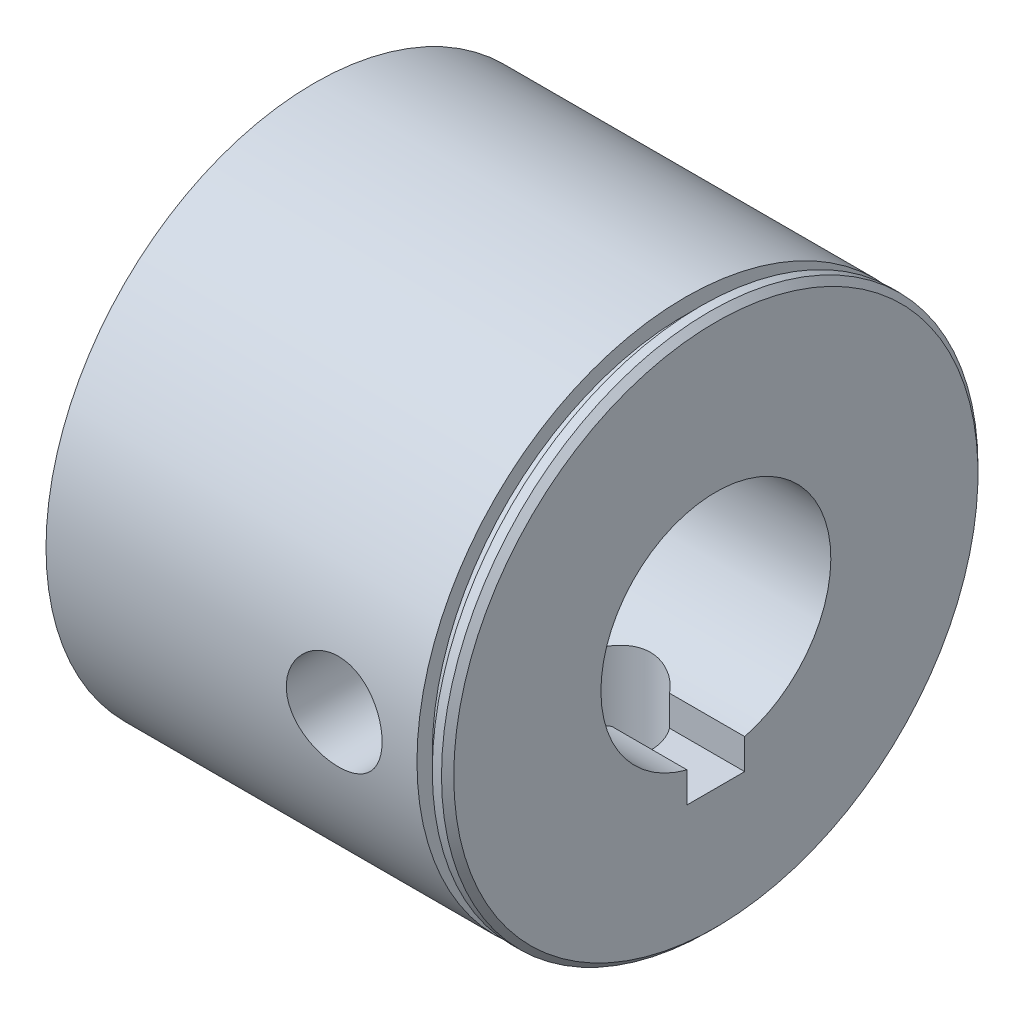
ISO-10303-21;
HEADER;
FILE_DESCRIPTION(('STEP AP214'),'2;1');
FILE_NAME('part.step','',(''),(''),'','','');
FILE_SCHEMA(('AUTOMOTIVE_DESIGN { 1 0 10303 214 1 1 1 1 }'));
ENDSEC;
DATA;
#1=APPLICATION_CONTEXT('core data for automotive mechanical design processes');
#2=APPLICATION_PROTOCOL_DEFINITION('international standard','automotive_design',2000,#1);
#3=PRODUCT_CONTEXT('',#1,'mechanical');
#4=PRODUCT('Part','Part','',(#3));
#5=PRODUCT_RELATED_PRODUCT_CATEGORY('part','',(#4));
#6=PRODUCT_DEFINITION_FORMATION('','',#4);
#7=PRODUCT_DEFINITION_CONTEXT('part definition',#1,'design');
#8=PRODUCT_DEFINITION('design','',#6,#7);
#9=PRODUCT_DEFINITION_SHAPE('','',#8);
#10=(LENGTH_UNIT() NAMED_UNIT(*) SI_UNIT(.MILLI.,.METRE.));
#11=(NAMED_UNIT(*) PLANE_ANGLE_UNIT() SI_UNIT($,.RADIAN.));
#12=(NAMED_UNIT(*) SI_UNIT($,.STERADIAN.) SOLID_ANGLE_UNIT());
#13=UNCERTAINTY_MEASURE_WITH_UNIT(LENGTH_MEASURE(1.E-05),#10,'distance_accuracy_value','');
#14=(GEOMETRIC_REPRESENTATION_CONTEXT(3) GLOBAL_UNCERTAINTY_ASSIGNED_CONTEXT((#13)) GLOBAL_UNIT_ASSIGNED_CONTEXT((#10,
#11,#12)) REPRESENTATION_CONTEXT('',''));
#15=CARTESIAN_POINT('',(0.,0.,0.));
#16=DIRECTION('',(0.,0.,1.));
#17=DIRECTION('',(1.,0.,0.));
#18=AXIS2_PLACEMENT_3D('',#15,#16,#17);
#19=CARTESIAN_POINT('',(29.6418,0.,0.));
#20=DIRECTION('',(-1.,0.,0.));
#21=DIRECTION('',(0.,0.,1.));
#22=AXIS2_PLACEMENT_3D('',#19,#20,#21);
#23=CONICAL_SURFACE('',#22,22.225,0.785398163397455);
#24=CARTESIAN_POINT('',(30.1498,0.,0.));
#25=DIRECTION('',(-1.,0.,0.));
#26=DIRECTION('',(0.,0.,1.));
#27=AXIS2_PLACEMENT_3D('',#24,#25,#26);
#28=CIRCLE('',#27,21.717);
#29=CARTESIAN_POINT('',(30.1498,0.,21.717));
#30=VERTEX_POINT('',#29);
#31=EDGE_CURVE('E20',#30,#30,#28,.F.);
#32=ORIENTED_EDGE('',*,*,#31,.F.);
#33=EDGE_LOOP('',(#32));
#34=FACE_BOUND('',#33,.T.);
#35=CARTESIAN_POINT('',(29.6418,0.,0.));
#36=DIRECTION('',(1.,0.,0.));
#37=DIRECTION('',(0.,1.,0.));
#38=AXIS2_PLACEMENT_3D('',#35,#36,#37);
#39=CIRCLE('',#38,22.225);
#40=CARTESIAN_POINT('',(29.6418,22.225,0.));
#41=VERTEX_POINT('',#40);
#42=EDGE_CURVE('E139',#41,#41,#39,.F.);
#43=ORIENTED_EDGE('',*,*,#42,.F.);
#44=EDGE_LOOP('',(#43));
#45=FACE_BOUND('',#44,.T.);
#46=ADVANCED_FACE('F17',(#34,#45),#23,.T.);
#47=CARTESIAN_POINT('',(30.1498,0.,0.));
#48=DIRECTION('',(1.,0.,0.));
#49=DIRECTION('',(0.,1.,0.));
#50=AXIS2_PLACEMENT_3D('',#47,#48,#49);
#51=CYLINDRICAL_SURFACE('',#50,22.225);
#52=CARTESIAN_POINT('',(28.8798,0.,0.));
#53=DIRECTION('',(1.,0.,0.));
#54=DIRECTION('',(0.,1.,0.));
#55=AXIS2_PLACEMENT_3D('',#52,#53,#54);
#56=CIRCLE('',#55,22.225);
#57=CARTESIAN_POINT('',(28.8798,22.225,0.));
#58=VERTEX_POINT('',#57);
#59=EDGE_CURVE('E95',#58,#58,#56,.F.);
#60=ORIENTED_EDGE('',*,*,#59,.F.);
#61=EDGE_LOOP('',(#60));
#62=FACE_BOUND('',#61,.T.);
#63=ORIENTED_EDGE('',*,*,#42,.T.);
#64=EDGE_LOOP('',(#63));
#65=FACE_BOUND('',#64,.T.);
#66=ADVANCED_FACE('F290',(#62,#65),#51,.T.);
#67=CARTESIAN_POINT('',(30.1498,0.,0.));
#68=DIRECTION('',(1.,0.,0.));
#69=DIRECTION('',(0.,1.,0.));
#70=AXIS2_PLACEMENT_3D('',#67,#68,#69);
#71=PLANE('',#70);
#72=DIRECTION('',(0.,0.,-1.));
#73=VECTOR('',#72,1.);
#74=CARTESIAN_POINT('',(30.1498,-11.7348,2.38759999999982));
#75=LINE('',#74,#73);
#76=CARTESIAN_POINT('',(30.1498,-11.7348,-2.38760000000017));
#77=VERTEX_POINT('',#76);
#78=CARTESIAN_POINT('',(30.1498,-11.7348,2.38759999999982));
#79=VERTEX_POINT('',#78);
#80=EDGE_CURVE('E124',#77,#79,#75,.F.);
#81=ORIENTED_EDGE('',*,*,#80,.T.);
#82=DIRECTION('',(0.,-1.,0.));
#83=VECTOR('',#82,1.);
#84=CARTESIAN_POINT('',(30.1498,0.,2.3876));
#85=LINE('',#84,#83);
#86=CARTESIAN_POINT('',(30.1498,-9.22089969796878,2.38759999999986));
#87=VERTEX_POINT('',#86);
#88=EDGE_CURVE('E80',#79,#87,#85,.F.);
#89=ORIENTED_EDGE('',*,*,#88,.T.);
#90=CARTESIAN_POINT('',(30.1498,0.,0.));
#91=DIRECTION('',(1.,0.,0.));
#92=DIRECTION('',(0.,0.,-1.));
#93=AXIS2_PLACEMENT_3D('',#90,#91,#92);
#94=CIRCLE('',#93,9.525);
#95=CARTESIAN_POINT('',(30.1498,-9.22089969796871,-2.38760000000013));
#96=VERTEX_POINT('',#95);
#97=EDGE_CURVE('E98',#87,#96,#94,.F.);
#98=ORIENTED_EDGE('',*,*,#97,.T.);
#99=DIRECTION('',(0.,1.,0.));
#100=VECTOR('',#99,1.);
#101=CARTESIAN_POINT('',(30.1498,0.,-2.3876));
#102=LINE('',#101,#100);
#103=EDGE_CURVE('E86',#96,#77,#102,.F.);
#104=ORIENTED_EDGE('',*,*,#103,.T.);
#105=EDGE_LOOP('',(#81,#89,#98,#104));
#106=FACE_BOUND('',#105,.T.);
#107=ORIENTED_EDGE('',*,*,#31,.T.);
#108=EDGE_LOOP('',(#107));
#109=FACE_BOUND('',#108,.T.);
#110=ADVANCED_FACE('F99',(#106,#109),#71,.T.);
#111=CARTESIAN_POINT('',(28.8798,22.225,0.));
#112=DIRECTION('',(-1.,0.,0.));
#113=DIRECTION('',(0.,0.,1.));
#114=AXIS2_PLACEMENT_3D('',#111,#112,#113);
#115=PLANE('',#114);
#116=CARTESIAN_POINT('',(28.8798,0.,0.));
#117=DIRECTION('',(-1.,0.,0.));
#118=DIRECTION('',(0.,0.,1.));
#119=AXIS2_PLACEMENT_3D('',#116,#117,#118);
#120=CIRCLE('',#119,20.955);
#121=CARTESIAN_POINT('',(28.8798,0.,20.955));
#122=VERTEX_POINT('',#121);
#123=EDGE_CURVE('E197',#122,#122,#120,.T.);
#124=ORIENTED_EDGE('',*,*,#123,.F.);
#125=EDGE_LOOP('',(#124));
#126=FACE_BOUND('',#125,.T.);
#127=ORIENTED_EDGE('',*,*,#59,.T.);
#128=EDGE_LOOP('',(#127));
#129=FACE_BOUND('',#128,.T.);
#130=ADVANCED_FACE('F288',(#126,#129),#115,.T.);
#131=CARTESIAN_POINT('',(-89.79,0.,-2.3876));
#132=DIRECTION('',(0.,0.,-1.));
#133=DIRECTION('',(0.,1.,0.));
#134=AXIS2_PLACEMENT_3D('',#131,#132,#133);
#135=PLANE('',#134);
#136=DIRECTION('',(1.,0.,0.));
#137=VECTOR('',#136,1.);
#138=CARTESIAN_POINT('',(30.1498,-9.22089969796871,-2.38760000000013));
#139=LINE('',#138,#137);
#140=CARTESIAN_POINT('',(23.9220275632044,-9.22089969796871,-2.3876000000001));
#141=VERTEX_POINT('',#140);
#142=EDGE_CURVE('E89',#96,#141,#139,.F.);
#143=ORIENTED_EDGE('',*,*,#142,.T.);
#144=DIRECTION('',(0.,1.,0.));
#145=VECTOR('',#144,1.);
#146=CARTESIAN_POINT('',(23.9220275632044,0.,-2.38760000000007));
#147=LINE('',#146,#145);
#148=CARTESIAN_POINT('',(23.9220275632044,-11.7348,-2.38760000000012));
#149=VERTEX_POINT('',#148);
#150=EDGE_CURVE('E229',#141,#149,#147,.F.);
#151=ORIENTED_EDGE('',*,*,#150,.T.);
#152=DIRECTION('',(1.,0.,0.));
#153=VECTOR('',#152,1.);
#154=CARTESIAN_POINT('',(-89.79,-11.7347999999999,-2.38760000000017));
#155=LINE('',#154,#153);
#156=EDGE_CURVE('E92',#149,#77,#155,.T.);
#157=ORIENTED_EDGE('',*,*,#156,.T.);
#158=ORIENTED_EDGE('',*,*,#103,.F.);
#159=EDGE_LOOP('',(#143,#151,#157,#158));
#160=FACE_BOUND('',#159,.T.);
#161=ADVANCED_FACE('F87',(#160),#135,.F.);
#162=CARTESIAN_POINT('',(-89.79,-11.7348,2.38759999999982));
#163=DIRECTION('',(0.,-1.,0.));
#164=DIRECTION('',(0.,0.,-1.));
#165=AXIS2_PLACEMENT_3D('',#162,#163,#164);
#166=PLANE('',#165);
#167=DIRECTION('',(1.,0.,0.));
#168=VECTOR('',#167,1.);
#169=CARTESIAN_POINT('',(-89.79,-11.7348,2.38759999999982));
#170=LINE('',#169,#168);
#171=CARTESIAN_POINT('',(23.9220275632046,-11.7348,2.38759999999984));
#172=VERTEX_POINT('',#171);
#173=EDGE_CURVE('E117',#172,#79,#170,.T.);
#174=ORIENTED_EDGE('',*,*,#173,.T.);
#175=ORIENTED_EDGE('',*,*,#80,.F.);
#176=ORIENTED_EDGE('',*,*,#156,.F.);
#177=CARTESIAN_POINT('',(20.7518,-11.7348,0.));
#178=DIRECTION('',(0.,1.,0.));
#179=DIRECTION('',(0.,0.,1.));
#180=AXIS2_PLACEMENT_3D('',#177,#178,#179);
#181=CIRCLE('',#180,3.96875000000016);
#182=EDGE_CURVE('E227',#149,#172,#181,.F.);
#183=ORIENTED_EDGE('',*,*,#182,.T.);
#184=EDGE_LOOP('',(#174,#175,#176,#183));
#185=FACE_BOUND('',#184,.T.);
#186=ADVANCED_FACE('F308',(#185),#166,.F.);
#187=CARTESIAN_POINT('',(-89.79,0.,2.3876));
#188=DIRECTION('',(0.,0.,1.));
#189=DIRECTION('',(0.,-1.,0.));
#190=AXIS2_PLACEMENT_3D('',#187,#188,#189);
#191=PLANE('',#190);
#192=DIRECTION('',(1.,0.,0.));
#193=VECTOR('',#192,1.);
#194=CARTESIAN_POINT('',(30.1498,-9.22089969796878,2.38759999999986));
#195=LINE('',#194,#193);
#196=CARTESIAN_POINT('',(23.9220275632046,-9.22089969796878,2.38759999999986));
#197=VERTEX_POINT('',#196);
#198=EDGE_CURVE('E105',#197,#87,#195,.T.);
#199=ORIENTED_EDGE('',*,*,#198,.T.);
#200=ORIENTED_EDGE('',*,*,#88,.F.);
#201=ORIENTED_EDGE('',*,*,#173,.F.);
#202=DIRECTION('',(0.,1.,0.));
#203=VECTOR('',#202,1.);
#204=CARTESIAN_POINT('',(23.9220275632046,0.,2.38759999999986));
#205=LINE('',#204,#203);
#206=EDGE_CURVE('E226',#172,#197,#205,.T.);
#207=ORIENTED_EDGE('',*,*,#206,.T.);
#208=EDGE_LOOP('',(#199,#200,#201,#207));
#209=FACE_BOUND('',#208,.T.);
#210=ADVANCED_FACE('F205',(#209),#191,.F.);
#211=CARTESIAN_POINT('',(30.1498,0.,0.));
#212=DIRECTION('',(1.,0.,0.));
#213=DIRECTION('',(0.,0.,-1.));
#214=AXIS2_PLACEMENT_3D('',#211,#212,#213);
#215=CYLINDRICAL_SURFACE('',#214,9.525);
#216=CARTESIAN_POINT('',(20.7518,-3.96875000000003,8.65879024099208));
#217=CARTESIAN_POINT('',(20.8578530929872,-3.96875345794214,8.65878657877948));
#218=CARTESIAN_POINT('',(20.9638730324885,-3.96449709079524,8.66074282150398));
#219=CARTESIAN_POINT('',(21.1751248510294,-3.94753019537077,8.66849040530834));
#220=CARTESIAN_POINT('',(21.2803565951006,-3.93481825120507,8.67428238868304));
#221=CARTESIAN_POINT('',(21.4892627782111,-3.90106722515466,8.68951324474217));
#222=CARTESIAN_POINT('',(21.5929363787864,-3.88002381554369,8.69895401270356));
#223=CARTESIAN_POINT('',(21.7979554621619,-3.82984231627085,8.72116264093307));
#224=CARTESIAN_POINT('',(21.899300005952,-3.80070102167462,8.73393181837569));
#225=CARTESIAN_POINT('',(22.1980509739908,-3.70177591753157,8.77654133512902));
#226=CARTESIAN_POINT('',(22.3911136335153,-3.62033653507982,8.81075784381483));
#227=CARTESIAN_POINT('',(22.7607671288055,-3.42905732293149,8.8869410521563));
#228=CARTESIAN_POINT('',(22.9373548256708,-3.31921209617303,8.92890922418128));
#229=CARTESIAN_POINT('',(23.2801166007337,-3.06698058400019,9.01876739103891));
#230=CARTESIAN_POINT('',(23.4451483490789,-2.92311286929135,9.06685761217828));
#231=CARTESIAN_POINT('',(23.74964941965,-2.60989482739701,9.16191979527028));
#232=CARTESIAN_POINT('',(23.8891076701367,-2.44053352057238,9.20889126525164));
#233=CARTESIAN_POINT('',(24.0790685405119,-2.16642299532665,9.27586449527777));
#234=CARTESIAN_POINT('',(24.1402495969044,-2.06943809274469,9.29803429099985));
#235=CARTESIAN_POINT('',(24.2541620047798,-1.87018393644445,9.34014905081815));
#236=CARTESIAN_POINT('',(24.3068967285485,-1.7679168133838,9.36009490187594));
#237=CARTESIAN_POINT('',(24.4034031211505,-1.55885091741736,9.39717346201771));
#238=CARTESIAN_POINT('',(24.4471822503326,-1.4520560066127,9.41430851022969));
#239=CARTESIAN_POINT('',(24.5253806796708,-1.23467043981326,9.44527793798247));
#240=CARTESIAN_POINT('',(24.5598023877699,-1.12408076858852,9.45911316655249));
#241=CARTESIAN_POINT('',(24.6326853768716,-0.847671005971583,9.48864159039333));
#242=CARTESIAN_POINT('',(24.665565613084,-0.680109318501017,9.50220067988519));
#243=CARTESIAN_POINT('',(24.709493769816,-0.341670225901581,9.52037713094985));
#244=CARTESIAN_POINT('',(24.7205449023185,-0.170793312319525,9.5249958080328));
#245=CARTESIAN_POINT('',(24.7205531788351,0.106504061188385,9.52500261404574));
#246=CARTESIAN_POINT('',(24.7162610228509,0.212975613388727,9.5232108503883));
#247=CARTESIAN_POINT('',(24.6991472118817,0.425144049751431,9.5160985722582));
#248=CARTESIAN_POINT('',(24.6863241558164,0.530840803780701,9.51077747814301));
#249=CARTESIAN_POINT('',(24.6522691464611,0.740688277942028,9.4967398192037));
#250=CARTESIAN_POINT('',(24.6310335887076,0.844838315488657,9.48802179894155));
#251=CARTESIAN_POINT('',(24.5803789940088,1.05082290262101,9.46742513768069));
#252=CARTESIAN_POINT('',(24.5509567971528,1.15265654166314,9.45554527633946));
#253=CARTESIAN_POINT('',(24.451000660174,1.45300600135495,9.41567532302138));
#254=CARTESIAN_POINT('',(24.3686458508143,1.64716692064387,9.38339816617054));
#255=CARTESIAN_POINT('',(24.1752120199395,2.01871297244167,9.31055338629856));
#256=CARTESIAN_POINT('',(24.0641293502543,2.19609597040101,9.26998471046923));
#257=CARTESIAN_POINT('',(23.8105055074592,2.5382368890557,9.18234990184274));
#258=CARTESIAN_POINT('',(23.6667602488233,2.70204950848217,9.13507176863117));
#259=CARTESIAN_POINT('',(23.3544787295999,3.00404954837416,9.04026684338799));
#260=CARTESIAN_POINT('',(23.1859283278362,3.14222224950122,8.99273992453093));
#261=CARTESIAN_POINT('',(22.8185202652051,3.39584880804115,8.90016856070738));
#262=CARTESIAN_POINT('',(22.6185738157747,3.50983532214996,8.85536428125949));
#263=CARTESIAN_POINT('',(22.3051471350228,3.65395015526098,8.79641726908517));
#264=CARTESIAN_POINT('',(22.1984303724775,3.6975082970466,8.77814607498311));
#265=CARTESIAN_POINT('',(21.9811568234327,3.77530902875157,8.74496726765578));
#266=CARTESIAN_POINT('',(21.8706010995764,3.80955417373634,8.73005873206089));
#267=CARTESIAN_POINT('',(21.5951068674637,3.88179419396879,8.69824875974411));
#268=CARTESIAN_POINT('',(21.4284420512504,3.91432870545512,8.68355945887815));
#269=CARTESIAN_POINT('',(21.0917559690582,3.9578015478199,8.66383415729869));
#270=CARTESIAN_POINT('',(20.9217354226929,3.9687444591257,8.65879610918162));
#271=CARTESIAN_POINT('',(20.6457469070128,3.96875345794208,8.65878657877951));
#272=CARTESIAN_POINT('',(20.5397269675115,3.96449709079518,8.66074282150401));
#273=CARTESIAN_POINT('',(20.3284751489706,3.94753019537071,8.66849040530837));
#274=CARTESIAN_POINT('',(20.2232434048994,3.93481825120501,8.67428238868307));
#275=CARTESIAN_POINT('',(20.0143372217889,3.9010672251546,8.6895132447422));
#276=CARTESIAN_POINT('',(19.9106636212136,3.88002381554363,8.69895401270358));
#277=CARTESIAN_POINT('',(19.7056445378381,3.82984231627078,8.7211626409331));
#278=CARTESIAN_POINT('',(19.604299994048,3.80070102167456,8.73393181837571));
#279=CARTESIAN_POINT('',(19.3055490260092,3.7017759175315,8.77654133512905));
#280=CARTESIAN_POINT('',(19.1124863664847,3.62033653507976,8.81075784381486));
#281=CARTESIAN_POINT('',(18.7428328711945,3.42905732293143,8.88694105215632));
#282=CARTESIAN_POINT('',(18.5662451743292,3.31921209617297,8.9289092241813));
#283=CARTESIAN_POINT('',(18.2234833992663,3.06698058400013,9.01876739103894));
#284=CARTESIAN_POINT('',(18.0584516509211,2.92311286929128,9.0668576121783));
#285=CARTESIAN_POINT('',(17.75395058035,2.60989482739695,9.1619197952703));
#286=CARTESIAN_POINT('',(17.6144923298633,2.44053352057231,9.20889126525166));
#287=CARTESIAN_POINT('',(17.4245314594881,2.16642299532658,9.27586449527778));
#288=CARTESIAN_POINT('',(17.3633504030956,2.06943809274462,9.29803429099987));
#289=CARTESIAN_POINT('',(17.2494379952202,1.87018393644438,9.34014905081816));
#290=CARTESIAN_POINT('',(17.1967032714515,1.76791681338373,9.36009490187596));
#291=CARTESIAN_POINT('',(17.1001968788495,1.55885091741728,9.39717346201772));
#292=CARTESIAN_POINT('',(17.0564177496674,1.45205600661263,9.4143085102297));
#293=CARTESIAN_POINT('',(16.9782193203292,1.23467043981319,9.44527793798248));
#294=CARTESIAN_POINT('',(16.9437976122301,1.12408076858845,9.4591131665525));
#295=CARTESIAN_POINT('',(16.8709146231284,0.847671005971523,9.48864159039333));
#296=CARTESIAN_POINT('',(16.838034386916,0.680109318500969,9.50220067988519));
#297=CARTESIAN_POINT('',(16.794106230184,0.341670225901558,9.52037713094985));
#298=CARTESIAN_POINT('',(16.7830550976815,0.170793312319514,9.5249958080328));
#299=CARTESIAN_POINT('',(16.7830468211649,-0.106504061188383,9.52500261404574));
#300=CARTESIAN_POINT('',(16.7873389771491,-0.212975613388724,9.5232108503883));
#301=CARTESIAN_POINT('',(16.8044527881182,-0.425144049751427,9.5160985722582));
#302=CARTESIAN_POINT('',(16.8172758441836,-0.530840803780697,9.51077747814301));
#303=CARTESIAN_POINT('',(16.8513308535389,-0.740688277942024,9.4967398192037));
#304=CARTESIAN_POINT('',(16.8725664112924,-0.844838315488652,9.48802179894155));
#305=CARTESIAN_POINT('',(16.9232210059912,-1.050822902621,9.46742513768069));
#306=CARTESIAN_POINT('',(16.9526432028472,-1.15265654166314,9.45554527633946));
#307=CARTESIAN_POINT('',(17.0525993398259,-1.45300600135495,9.41567532302138));
#308=CARTESIAN_POINT('',(17.1349541491856,-1.64716692064387,9.38339816617054));
#309=CARTESIAN_POINT('',(17.3283879800605,-2.01871297244166,9.31055338629856));
#310=CARTESIAN_POINT('',(17.4394706497457,-2.19609597040101,9.26998471046923));
#311=CARTESIAN_POINT('',(17.6930944925407,-2.5382368890557,9.18234990184274));
#312=CARTESIAN_POINT('',(17.8368397511766,-2.70204950848218,9.13507176863117));
#313=CARTESIAN_POINT('',(18.1491212704,-3.00404954837417,9.04026684338799));
#314=CARTESIAN_POINT('',(18.3176716721638,-3.14222224950123,8.99273992453092));
#315=CARTESIAN_POINT('',(18.6850797347948,-3.39584880804117,8.90016856070737));
#316=CARTESIAN_POINT('',(18.8850261842252,-3.50983532214999,8.85536428125948));
#317=CARTESIAN_POINT('',(19.1984528649771,-3.65395015526101,8.79641726908516));
#318=CARTESIAN_POINT('',(19.3051696275224,-3.69750829704664,8.77814607498309));
#319=CARTESIAN_POINT('',(19.5224431765672,-3.77530902875161,8.74496726765576));
#320=CARTESIAN_POINT('',(19.6329989004235,-3.80955417373638,8.73005873206088));
#321=CARTESIAN_POINT('',(19.9084931325362,-3.88179419396884,8.69824875974409));
#322=CARTESIAN_POINT('',(20.0751579487495,-3.91432870545517,8.68355945887812));
#323=CARTESIAN_POINT('',(20.4118440309418,-3.95780154781996,8.66383415729866));
#324=CARTESIAN_POINT('',(20.5818645773071,-3.96874445912577,8.65879610918159));
#325=CARTESIAN_POINT('',(20.7518,-3.96875000000003,8.65879024099208));
#326=B_SPLINE_CURVE_WITH_KNOTS('',3,(#216,#217,#218,#219,#220,#221,#222,#223,#224,#225,#226,
#227,#228,#229,#230,#231,#232,#233,#234,#235,#236,#237,#238,#239,#240,#241,#242,#243,#244,#245,
#246,#247,#248,#249,#250,#251,#252,#253,#254,#255,#256,#257,#258,#259,#260,#261,#262,#263,#264,
#265,#266,#267,#268,#269,#270,#271,#272,#273,#274,#275,#276,#277,#278,#279,#280,#281,#282,#283,
#284,#285,#286,#287,#288,#289,#290,#291,#292,#293,#294,#295,#296,#297,#298,#299,#300,#301,#302,
#303,#304,#305,#306,#307,#308,#309,#310,#311,#312,#313,#314,#315,#316,#317,#318,#319,#320,#321,
#322,#323,#324,#325),.UNSPECIFIED.,.T.,.F.,(4,2,2,2,2,2,2,2,2,2,2,2,2,2,2,2,2,2,2,2,2,2,2,2,2,2,
2,2,2,2,2,2,2,2,2,2,2,2,2,2,2,2,2,2,2,2,2,2,2,2,2,2,2,2,4),(0.,0.31799864322004,
0.636050548788208,0.954267881589922,1.27261133643129,1.90647123333069,2.54045165112497,
3.2100479993298,3.87993356033902,4.22994082370144,4.57980799279898,4.92938251166585,
5.27886698926793,5.79106914908675,6.30319593672515,6.62255026029966,6.94195704629062,
7.26150083522382,7.5811681344089,8.21810554330669,8.85512387706073,9.52120693428627,
10.1876712007541,10.8872023715017,11.2369065357748,11.5865146600165,12.0961716614412,
12.6057205329473,12.9237191761673,13.2417710817355,13.5599884145372,13.8783318693786,
14.512191766278,15.1461721840723,15.8157685322771,16.4856540932863,16.8356613566487,
17.1855285257463,17.5351030446131,17.8845875222152,18.396789682034,18.9089164696724,
19.2282707932469,19.5476775792378,19.867221368171,20.1868886673561,20.8238260762539,
21.4608444100079,22.1269274672335,22.7933917337013,23.4929229044489,23.842627068722,
24.1922351929637,24.7018921943884,25.2114410658946),.UNSPECIFIED.);
#327=CARTESIAN_POINT('',(20.7518,-3.96875000000003,8.65879024099208));
#328=VERTEX_POINT('',#327);
#329=EDGE_CURVE('E189',#328,#328,#326,.T.);
#330=ORIENTED_EDGE('',*,*,#329,.T.);
#331=EDGE_LOOP('',(#330));
#332=FACE_BOUND('',#331,.T.);
#333=ORIENTED_EDGE('',*,*,#198,.F.);
#334=CARTESIAN_POINT('',(23.9220275632045,-9.22089969796877,2.38759999999989));
#335=CARTESIAN_POINT('',(23.854120340088,-9.19755743648972,2.47775927761388));
#336=CARTESIAN_POINT('',(23.7824861888871,-9.17358538278354,2.56487581772126));
#337=CARTESIAN_POINT('',(23.6321638122226,-9.12502401425333,2.73261360039876));
#338=CARTESIAN_POINT('',(23.5534754090143,-9.10043468388714,2.81323467920663));
#339=CARTESIAN_POINT('',(23.3070145208035,-9.02658046070975,3.04512799993568));
#340=CARTESIAN_POINT('',(23.1291976782232,-8.97735529279212,3.18596491671017));
#341=CARTESIAN_POINT('',(22.7507849502404,-8.88465240540711,3.43605753129749));
#342=CARTESIAN_POINT('',(22.5501591537454,-8.84118239854397,3.54527107794934));
#343=CARTESIAN_POINT('',(22.2364974152211,-8.78455282084632,3.68234637765692));
#344=CARTESIAN_POINT('',(22.1299076542591,-8.76711540093193,3.72355974013007));
#345=CARTESIAN_POINT('',(21.9131282431995,-8.7356651902145,3.79675751246543));
#346=CARTESIAN_POINT('',(21.802939690767,-8.72165136603989,3.82874470766419));
#347=CARTESIAN_POINT('',(21.5383361416543,-8.69311176206289,3.89321503285067));
#348=CARTESIAN_POINT('',(21.382681305705,-8.68032537361514,3.92147834707029));
#349=CARTESIAN_POINT('',(21.0685977386053,-8.66316589489767,3.95924564726818));
#350=CARTESIAN_POINT('',(20.9101684870823,-8.65879440036487,3.96874607520331));
#351=CARTESIAN_POINT('',(20.6457512319518,-8.65878745573863,3.96875262817372));
#352=CARTESIAN_POINT('',(20.539729711188,-8.66074302016718,3.96449694476381));
#353=CARTESIAN_POINT('',(20.3284754702149,-8.6684900942327,3.9475305875758));
#354=CARTESIAN_POINT('',(20.2232429037178,-8.6742823326871,3.93481830737438));
#355=CARTESIAN_POINT('',(20.0143360258166,-8.68951342452279,3.90106689472554));
#356=CARTESIAN_POINT('',(19.9106625269098,-8.69895411521476,3.88002356674575));
#357=CARTESIAN_POINT('',(19.7056436849401,-8.72116274938714,3.82984208841537));
#358=CARTESIAN_POINT('',(19.6042992773637,-8.73393200523143,3.80070074493465));
#359=CARTESIAN_POINT('',(19.305569910561,-8.77653818795005,3.70178291150463));
#360=CARTESIAN_POINT('',(19.1125292997933,-8.8107493529009,3.62035486370049));
#361=CARTESIAN_POINT('',(18.7428650054731,-8.88693406672273,3.42907784663467));
#362=CARTESIAN_POINT('',(18.5662477984647,-8.92891065853481,3.31921772929559));
#363=CARTESIAN_POINT('',(18.244309068758,-9.01330577297566,3.08230232878214));
#364=CARTESIAN_POINT('',(18.0976706440153,-9.05549540499666,2.95694900874123));
#365=CARTESIAN_POINT('',(17.8242415212855,-9.1393893835398,2.68651332005104));
#366=CARTESIAN_POINT('',(17.6974177510696,-9.18109442878234,2.54146459776652));
#367=CARTESIAN_POINT('',(17.5815724367954,-9.22089969796878,2.38759999999986));
#368=B_SPLINE_CURVE_WITH_KNOTS('',3,(#334,#335,#336,#337,#338,#339,#340,#341,#342,#343,#344,
#345,#346,#347,#348,#349,#350,#351,#352,#353,#354,#355,#356,#357,#358,#359,#360,#361,#362,#363,
#364,#365,#366,#367),.UNSPECIFIED.,.F.,.F.,(4,2,2,2,2,2,2,2,2,2,2,2,2,2,2,2,4),(0.,
0.345569950789382,0.691148611293108,1.38407329197287,2.07791737267134,2.4243204418867,
2.77061882392159,3.24540967149921,3.72029054596005,4.03828645937703,4.35634279686234,
4.67455951232273,4.9929018823625,5.62669760238196,6.26074220814331,6.85118575066234,
7.44063301838193),.UNSPECIFIED.);
#369=CARTESIAN_POINT('',(17.5815724367954,-9.22089969796877,2.38759999999986));
#370=VERTEX_POINT('',#369);
#371=EDGE_CURVE('E220',#197,#370,#368,.T.);
#372=ORIENTED_EDGE('',*,*,#371,.T.);
#373=DIRECTION('',(1.,0.,0.));
#374=VECTOR('',#373,1.);
#375=CARTESIAN_POINT('',(-89.79,-9.22089969796876,2.38759999999986));
#376=LINE('',#375,#374);
#377=CARTESIAN_POINT('',(-3.1242,-9.22089969796877,2.38759999999986));
#378=VERTEX_POINT('',#377);
#379=EDGE_CURVE('E104',#370,#378,#376,.F.);
#380=ORIENTED_EDGE('',*,*,#379,.T.);
#381=CARTESIAN_POINT('',(-3.1242,0.,0.));
#382=DIRECTION('',(1.,0.,0.));
#383=DIRECTION('',(0.,0.,-1.));
#384=AXIS2_PLACEMENT_3D('',#381,#382,#383);
#385=CIRCLE('',#384,9.525);
#386=CARTESIAN_POINT('',(-3.1242,-9.2208996979687,-2.38760000000015));
#387=VERTEX_POINT('',#386);
#388=EDGE_CURVE('E177',#387,#378,#385,.T.);
#389=ORIENTED_EDGE('',*,*,#388,.F.);
#390=DIRECTION('',(1.,0.,0.));
#391=VECTOR('',#390,1.);
#392=CARTESIAN_POINT('',(-89.79,-9.22089969796871,-2.38760000000013));
#393=LINE('',#392,#391);
#394=CARTESIAN_POINT('',(17.5815724367957,-9.2208996979687,-2.38760000000015));
#395=VERTEX_POINT('',#394);
#396=EDGE_CURVE('E198',#387,#395,#393,.T.);
#397=ORIENTED_EDGE('',*,*,#396,.T.);
#398=CARTESIAN_POINT('',(17.5815724367956,-9.22089969796871,-2.38760000000011));
#399=CARTESIAN_POINT('',(17.6494796599122,-9.19755743648966,-2.4777592776141));
#400=CARTESIAN_POINT('',(17.7211138111131,-9.17358538278348,-2.56487581772148));
#401=CARTESIAN_POINT('',(17.8714361877776,-9.12502401425327,-2.73261360039896));
#402=CARTESIAN_POINT('',(17.9501245909859,-9.10043468388707,-2.81323467920682));
#403=CARTESIAN_POINT('',(18.1965854791967,-9.02658046070969,-3.04512799993586));
#404=CARTESIAN_POINT('',(18.374402321777,-8.97735529279206,-3.18596491671033));
#405=CARTESIAN_POINT('',(18.7528150497598,-8.88465240540706,-3.43605753129762));
#406=CARTESIAN_POINT('',(18.9534408462548,-8.84118239854392,-3.54527107794946));
#407=CARTESIAN_POINT('',(19.2671025847791,-8.78455282084628,-3.68234637765702));
#408=CARTESIAN_POINT('',(19.3736923457412,-8.76711540093189,-3.72355974013016));
#409=CARTESIAN_POINT('',(19.5904717568007,-8.73566519021447,-3.79675751246551));
#410=CARTESIAN_POINT('',(19.7006603092332,-8.72165136603986,-3.82874470766427));
#411=CARTESIAN_POINT('',(19.9652638583459,-8.69311176206288,-3.89321503285072));
#412=CARTESIAN_POINT('',(20.1209186942951,-8.68032537361512,-3.92147834707032));
#413=CARTESIAN_POINT('',(20.4350022613948,-8.66316589489767,-3.95924564726819));
#414=CARTESIAN_POINT('',(20.5934315129177,-8.65879440036487,-3.96874607520331));
#415=CARTESIAN_POINT('',(20.8578487680482,-8.65878745573863,-3.96875262817372));
#416=CARTESIAN_POINT('',(20.963870288812,-8.66074302016718,-3.96449694476381));
#417=CARTESIAN_POINT('',(21.1751245297851,-8.6684900942327,-3.9475305875758));
#418=CARTESIAN_POINT('',(21.2803570962822,-8.6742823326871,-3.93481830737438));
#419=CARTESIAN_POINT('',(21.4892639741834,-8.68951342452279,-3.90106689472554));
#420=CARTESIAN_POINT('',(21.5929374730902,-8.69895411521476,-3.88002356674575));
#421=CARTESIAN_POINT('',(21.7979563150599,-8.72116274938714,-3.82984208841537));
#422=CARTESIAN_POINT('',(21.8993007226363,-8.73393200523143,-3.80070074493465));
#423=CARTESIAN_POINT('',(22.198030089439,-8.77653818795005,-3.70178291150463));
#424=CARTESIAN_POINT('',(22.3910707002067,-8.8107493529009,-3.62035486370049));
#425=CARTESIAN_POINT('',(22.7607349945269,-8.88693406672273,-3.42907784663467));
#426=CARTESIAN_POINT('',(22.9373522015353,-8.92891065853481,-3.31921772929559));
#427=CARTESIAN_POINT('',(23.2592909312419,-9.01330577297566,-3.08230232878217));
#428=CARTESIAN_POINT('',(23.4059293559846,-9.05549540499665,-2.95694900874128));
#429=CARTESIAN_POINT('',(23.6793584787144,-9.13938938353976,-2.68651332005117));
#430=CARTESIAN_POINT('',(23.8061822489303,-9.18109442878229,-2.5414645977667));
#431=CARTESIAN_POINT('',(23.9220275632044,-9.22089969796872,-2.38760000000007));
#432=B_SPLINE_CURVE_WITH_KNOTS('',3,(#398,#399,#400,#401,#402,#403,#404,#405,#406,#407,#408,
#409,#410,#411,#412,#413,#414,#415,#416,#417,#418,#419,#420,#421,#422,#423,#424,#425,#426,#427,
#428,#429,#430,#431),.UNSPECIFIED.,.F.,.F.,(4,2,2,2,2,2,2,2,2,2,2,2,2,2,2,2,4),(0.,
0.345569950789383,0.691148611293106,1.38407329197286,2.07791737267133,2.42432044188669,
2.77061882392158,3.24540967149906,3.72029054595977,4.03828645937674,4.35634279686206,
4.67455951232244,4.99290188236222,5.62669760238168,6.26074220814302,6.85118575066192,
7.44063301838137),.UNSPECIFIED.);
#433=EDGE_CURVE('E109',#395,#141,#432,.T.);
#434=ORIENTED_EDGE('',*,*,#433,.T.);
#435=ORIENTED_EDGE('',*,*,#142,.F.);
#436=ORIENTED_EDGE('',*,*,#97,.F.);
#437=EDGE_LOOP('',(#333,#372,#380,#389,#397,#434,#435,#436));
#438=FACE_BOUND('',#437,.T.);
#439=ADVANCED_FACE('F107',(#332,#438),#215,.F.);
#440=CARTESIAN_POINT('',(-89.79,0.,2.3876));
#441=DIRECTION('',(0.,0.,1.));
#442=DIRECTION('',(0.,-1.,0.));
#443=AXIS2_PLACEMENT_3D('',#440,#441,#442);
#444=PLANE('',#443);
#445=ORIENTED_EDGE('',*,*,#379,.F.);
#446=DIRECTION('',(0.,1.,0.));
#447=VECTOR('',#446,1.);
#448=CARTESIAN_POINT('',(17.5815724367954,0.,2.38759999999984));
#449=LINE('',#448,#447);
#450=CARTESIAN_POINT('',(17.5815724367955,-11.7348,2.38759999999988));
#451=VERTEX_POINT('',#450);
#452=EDGE_CURVE('E219',#370,#451,#449,.F.);
#453=ORIENTED_EDGE('',*,*,#452,.T.);
#454=DIRECTION('',(1.,0.,0.));
#455=VECTOR('',#454,1.);
#456=CARTESIAN_POINT('',(-89.79,-11.7348,2.38759999999992));
#457=LINE('',#456,#455);
#458=CARTESIAN_POINT('',(-3.1242,-11.7348,2.38759999999988));
#459=VERTEX_POINT('',#458);
#460=EDGE_CURVE('E249',#451,#459,#457,.F.);
#461=ORIENTED_EDGE('',*,*,#460,.T.);
#462=DIRECTION('',(0.,-1.,0.));
#463=VECTOR('',#462,1.);
#464=CARTESIAN_POINT('',(-3.1242,0.,2.38759999999986));
#465=LINE('',#464,#463);
#466=EDGE_CURVE('E255',#378,#459,#465,.T.);
#467=ORIENTED_EDGE('',*,*,#466,.F.);
#468=EDGE_LOOP('',(#445,#453,#461,#467));
#469=FACE_BOUND('',#468,.T.);
#470=ADVANCED_FACE('F204',(#469),#444,.F.);
#471=CARTESIAN_POINT('',(-89.79,-11.7348,2.38759999999982));
#472=DIRECTION('',(0.,-1.,0.));
#473=DIRECTION('',(0.,0.,-1.));
#474=AXIS2_PLACEMENT_3D('',#471,#472,#473);
#475=PLANE('',#474);
#476=DIRECTION('',(1.,0.,0.));
#477=VECTOR('',#476,1.);
#478=CARTESIAN_POINT('',(-89.79,-11.7348,-2.38760000000017));
#479=LINE('',#478,#477);
#480=CARTESIAN_POINT('',(17.5815724367957,-11.7348,-2.38760000000017));
#481=VERTEX_POINT('',#480);
#482=CARTESIAN_POINT('',(-3.1242,-11.7348,-2.38760000000017));
#483=VERTEX_POINT('',#482);
#484=EDGE_CURVE('E36',#481,#483,#479,.F.);
#485=ORIENTED_EDGE('',*,*,#484,.T.);
#486=DIRECTION('',(0.,0.,1.));
#487=VECTOR('',#486,1.);
#488=CARTESIAN_POINT('',(-3.1242,-11.7348,0.));
#489=LINE('',#488,#487);
#490=EDGE_CURVE('E252',#459,#483,#489,.F.);
#491=ORIENTED_EDGE('',*,*,#490,.F.);
#492=ORIENTED_EDGE('',*,*,#460,.F.);
#493=CARTESIAN_POINT('',(20.7518,-11.7348,0.));
#494=DIRECTION('',(0.,1.,0.));
#495=DIRECTION('',(0.,0.,1.));
#496=AXIS2_PLACEMENT_3D('',#493,#494,#495);
#497=CIRCLE('',#496,3.96875000000016);
#498=EDGE_CURVE('E217',#451,#481,#497,.F.);
#499=ORIENTED_EDGE('',*,*,#498,.T.);
#500=EDGE_LOOP('',(#485,#491,#492,#499));
#501=FACE_BOUND('',#500,.T.);
#502=ADVANCED_FACE('F318',(#501),#475,.F.);
#503=CARTESIAN_POINT('',(-89.79,0.,-2.3876));
#504=DIRECTION('',(0.,0.,-1.));
#505=DIRECTION('',(0.,1.,0.));
#506=AXIS2_PLACEMENT_3D('',#503,#504,#505);
#507=PLANE('',#506);
#508=ORIENTED_EDGE('',*,*,#396,.F.);
#509=DIRECTION('',(0.,-1.,0.));
#510=VECTOR('',#509,1.);
#511=CARTESIAN_POINT('',(-3.1242,0.,-2.38760000000017));
#512=LINE('',#511,#510);
#513=EDGE_CURVE('E176',#483,#387,#512,.F.);
#514=ORIENTED_EDGE('',*,*,#513,.F.);
#515=ORIENTED_EDGE('',*,*,#484,.F.);
#516=DIRECTION('',(0.,1.,0.));
#517=VECTOR('',#516,1.);
#518=CARTESIAN_POINT('',(17.5815724367957,0.,-2.38760000000018));
#519=LINE('',#518,#517);
#520=EDGE_CURVE('E216',#481,#395,#519,.T.);
#521=ORIENTED_EDGE('',*,*,#520,.T.);
#522=EDGE_LOOP('',(#508,#514,#515,#521));
#523=FACE_BOUND('',#522,.T.);
#524=ADVANCED_FACE('F184',(#523),#507,.F.);
#525=CARTESIAN_POINT('',(20.7518,0.,22.225));
#526=DIRECTION('',(0.,0.,-1.));
#527=DIRECTION('',(0.,1.,0.));
#528=AXIS2_PLACEMENT_3D('',#525,#526,#527);
#529=CYLINDRICAL_SURFACE('',#528,3.96875);
#530=ORIENTED_EDGE('',*,*,#329,.F.);
#531=EDGE_LOOP('',(#530));
#532=FACE_BOUND('',#531,.T.);
#533=CARTESIAN_POINT('',(20.7518,3.96874999999992,21.867776485905));
#534=CARTESIAN_POINT('',(20.862242636118,3.96874939226566,21.8677767602575));
#535=CARTESIAN_POINT('',(20.9727004163819,3.96413569219431,21.8686154974175));
#536=CARTESIAN_POINT('',(21.1928623582988,3.94571332924569,21.8719467812869));
#537=CARTESIAN_POINT('',(21.3025661490558,3.93190042843594,21.8744400902306));
#538=CARTESIAN_POINT('',(21.520575385004,3.89514987144147,21.8810142396303));
#539=CARTESIAN_POINT('',(21.6288783271779,3.87219772983356,21.8850976000426));
#540=CARTESIAN_POINT('',(21.8431423595681,3.81735533042697,21.8947296463723));
#541=CARTESIAN_POINT('',(21.9491025429119,3.78546167456475,21.9002788893259));
#542=CARTESIAN_POINT('',(22.2619730717987,3.67680964916353,21.9188771458524));
#543=CARTESIAN_POINT('',(22.4644048107322,3.58698992518608,21.9338938717271));
#544=CARTESIAN_POINT('',(22.8511457567725,3.37526108072015,21.9674678496212));
#545=CARTESIAN_POINT('',(23.0354613814016,3.25336338033922,21.9860238409779));
#546=CARTESIAN_POINT('',(23.3830627620137,2.97940737605796,22.0248278857171));
#547=CARTESIAN_POINT('',(23.5461141951588,2.82705339979205,22.0450913015638));
#548=CARTESIAN_POINT('',(23.8444843051578,2.49715122728125,22.0848910813289));
#549=CARTESIAN_POINT('',(23.9797997936483,2.31960013848819,22.1044273614489));
#550=CARTESIAN_POINT('',(24.2197360222392,1.94283484404565,22.1407322487181));
#551=CARTESIAN_POINT('',(24.3241397070742,1.74348031319456,22.1574809389394));
#552=CARTESIAN_POINT('',(24.4978876135916,1.32971473489737,22.1861541422642));
#553=CARTESIAN_POINT('',(24.5672347510136,1.11530494132454,22.1980790565565));
#554=CARTESIAN_POINT('',(24.6681885938242,0.679916397485027,22.2156540237676));
#555=CARTESIAN_POINT('',(24.700186160092,0.459030941854939,22.2213690185752));
#556=CARTESIAN_POINT('',(24.7267490806145,0.0149573644596397,22.2261037452233));
#557=CARTESIAN_POINT('',(24.7213172772119,-0.20823058117197,22.2251239854558));
#558=CARTESIAN_POINT('',(24.673477977728,-0.647894355631876,22.2166306580354));
#559=CARTESIAN_POINT('',(24.6314915582586,-0.864417646451831,22.2091914995076));
#560=CARTESIAN_POINT('',(24.51239825955,-1.28729742536027,22.1886983406287));
#561=CARTESIAN_POINT('',(24.4352899110835,-1.49365348773104,22.1756441053879));
#562=CARTESIAN_POINT('',(24.2477324393134,-1.89157949533966,22.1452617876054));
#563=CARTESIAN_POINT('',(24.1371116588414,-2.08306678025438,22.1279117869714));
#564=CARTESIAN_POINT('',(23.8857950388308,-2.44490698640747,22.0908619816255));
#565=CARTESIAN_POINT('',(23.7450986963396,-2.61525955413553,22.0711621376195));
#566=CARTESIAN_POINT('',(23.4353607802396,-2.93245913235314,22.0312791039267));
#567=CARTESIAN_POINT('',(23.2659564141264,-3.07895114182165,22.011092991898));
#568=CARTESIAN_POINT('',(22.9045962242434,-3.34159862141917,21.9727567806047));
#569=CARTESIAN_POINT('',(22.7126303561112,-3.45774050496003,21.9546075952613));
#570=CARTESIAN_POINT('',(22.4118602440458,-3.60663227272181,21.9304660897002));
#571=CARTESIAN_POINT('',(22.3092860575241,-3.65209688351526,21.9229227079668));
#572=CARTESIAN_POINT('',(22.1005962407809,-3.73420323696796,21.9090869485221));
#573=CARTESIAN_POINT('',(21.9944820027668,-3.77084840257237,21.9027940856336));
#574=CARTESIAN_POINT('',(21.7796503304319,-3.83497760012956,21.8916565995994));
#575=CARTESIAN_POINT('',(21.670937561204,-3.86247689561902,21.8868095649205));
#576=CARTESIAN_POINT('',(21.4515600053551,-3.9081779626888,21.8786953798662));
#577=CARTESIAN_POINT('',(21.3408961821683,-3.92638419713992,21.8754274711765));
#578=CARTESIAN_POINT('',(21.150409781564,-3.94948899290828,21.8712654442787));
#579=CARTESIAN_POINT('',(21.0708696890173,-3.95670884901249,21.8699589399115));
#580=CARTESIAN_POINT('',(20.9114890365532,-3.96633957521749,21.8682143610123));
#581=CARTESIAN_POINT('',(20.8316484762651,-3.96875043938343,21.867776287552));
#582=CARTESIAN_POINT('',(20.641357363882,-3.96874939226582,21.8677767602575));
#583=CARTESIAN_POINT('',(20.5308995836181,-3.96413569219448,21.8686154974175));
#584=CARTESIAN_POINT('',(20.3107376417012,-3.94571332924585,21.8719467812869));
#585=CARTESIAN_POINT('',(20.2010338509442,-3.9319004284361,21.8744400902305));
#586=CARTESIAN_POINT('',(19.983024614996,-3.89514987144163,21.8810142396303));
#587=CARTESIAN_POINT('',(19.8747216728221,-3.87219772983373,21.8850976000425));
#588=CARTESIAN_POINT('',(19.6604576404319,-3.81735533042713,21.8947296463722));
#589=CARTESIAN_POINT('',(19.5544974570881,-3.78546167456492,21.9002788893259));
#590=CARTESIAN_POINT('',(19.2416269282013,-3.67680964916369,21.9188771458524));
#591=CARTESIAN_POINT('',(19.0391951892678,-3.58698992518624,21.9338938717271));
#592=CARTESIAN_POINT('',(18.6524542432275,-3.37526108072032,21.9674678496212));
#593=CARTESIAN_POINT('',(18.4681386185984,-3.25336338033939,21.9860238409779));
#594=CARTESIAN_POINT('',(18.1205372379863,-2.97940737605813,22.024827885717));
#595=CARTESIAN_POINT('',(17.9574858048412,-2.82705339979222,22.0450913015638));
#596=CARTESIAN_POINT('',(17.6591156948422,-2.49715122728142,22.0848910813289));
#597=CARTESIAN_POINT('',(17.5238002063517,-2.31960013848836,22.1044273614489));
#598=CARTESIAN_POINT('',(17.2838639777608,-1.94283484404582,22.140732248718));
#599=CARTESIAN_POINT('',(17.1794602929258,-1.74348031319473,22.1574809389394));
#600=CARTESIAN_POINT('',(17.0057123864084,-1.32971473489754,22.1861541422642));
#601=CARTESIAN_POINT('',(16.9363652489864,-1.11530494132471,22.1980790565565));
#602=CARTESIAN_POINT('',(16.8354114061758,-0.679916397485194,22.2156540237676));
#603=CARTESIAN_POINT('',(16.803413839908,-0.459030941855106,22.2213690185752));
#604=CARTESIAN_POINT('',(16.7768509193855,-0.0149573644598075,22.2261037452233));
#605=CARTESIAN_POINT('',(16.7822827227881,0.208230581171802,22.2251239854558));
#606=CARTESIAN_POINT('',(16.830122022272,0.647894355631707,22.2166306580354));
#607=CARTESIAN_POINT('',(16.8721084417414,0.864417646451662,22.2091914995076));
#608=CARTESIAN_POINT('',(16.99120174045,1.2872974253601,22.1886983406287));
#609=CARTESIAN_POINT('',(17.0683100889166,1.49365348773088,22.1756441053879));
#610=CARTESIAN_POINT('',(17.2558675606866,1.89157949533949,22.1452617876054));
#611=CARTESIAN_POINT('',(17.3664883411586,2.08306678025421,22.1279117869715));
#612=CARTESIAN_POINT('',(17.6178049611692,2.44490698640731,22.0908619816255));
#613=CARTESIAN_POINT('',(17.7585013036604,2.61525955413537,22.0711621376195));
#614=CARTESIAN_POINT('',(18.0682392197604,2.93245913235297,22.0312791039267));
#615=CARTESIAN_POINT('',(18.2376435858736,3.07895114182149,22.011092991898));
#616=CARTESIAN_POINT('',(18.5990037757566,3.34159862141901,21.9727567806048));
#617=CARTESIAN_POINT('',(18.7909696438888,3.45774050495987,21.9546075952613));
#618=CARTESIAN_POINT('',(19.0917397559542,3.60663227272164,21.9304660897003));
#619=CARTESIAN_POINT('',(19.1943139424759,3.6520968835151,21.9229227079668));
#620=CARTESIAN_POINT('',(19.4030037592191,3.7342032369678,21.9090869485222));
#621=CARTESIAN_POINT('',(19.5091179972332,3.7708484025722,21.9027940856336));
#622=CARTESIAN_POINT('',(19.7239496695681,3.83497760012939,21.8916565995994));
#623=CARTESIAN_POINT('',(19.832662438796,3.86247689561885,21.8868095649205));
#624=CARTESIAN_POINT('',(20.0520399946449,3.90817796268864,21.8786953798662));
#625=CARTESIAN_POINT('',(20.1627038178317,3.92638419713975,21.8754274711765));
#626=CARTESIAN_POINT('',(20.353190218436,3.94948899290812,21.8712654442787));
#627=CARTESIAN_POINT('',(20.4327303109827,3.95670884901232,21.8699589399116));
#628=CARTESIAN_POINT('',(20.5921109634468,3.96633957521733,21.8682143610124));
#629=CARTESIAN_POINT('',(20.6719515237349,3.96875043938326,21.867776287552));
#630=CARTESIAN_POINT('',(20.7518,3.96874999999992,21.867776485905));
#631=B_SPLINE_CURVE_WITH_KNOTS('',3,(#533,#534,#535,#536,#537,#538,#539,#540,#541,#542,#543,
#544,#545,#546,#547,#548,#549,#550,#551,#552,#553,#554,#555,#556,#557,#558,#559,#560,#561,#562,
#563,#564,#565,#566,#567,#568,#569,#570,#571,#572,#573,#574,#575,#576,#577,#578,#579,#580,#581,
#582,#583,#584,#585,#586,#587,#588,#589,#590,#591,#592,#593,#594,#595,#596,#597,#598,#599,#600,
#601,#602,#603,#604,#605,#606,#607,#608,#609,#610,#611,#612,#613,#614,#615,#616,#617,#618,#619,
#620,#621,#622,#623,#624,#625,#626,#627,#628,#629,#630),.UNSPECIFIED.,.T.,.F.,(4,2,2,2,2,2,2,2,
2,2,2,2,2,2,2,2,2,2,2,2,2,2,2,2,2,2,2,2,2,2,2,2,2,2,2,2,2,2,2,2,2,2,2,2,2,2,2,2,4),(0.,
0.331254046842607,0.662660803066454,0.994594933338761,1.326655380672,1.98917876452162,
2.65146660120483,3.32052692167794,3.98966411036536,4.66339407564918,5.33706799592653,
6.00362689698265,6.67013518089244,7.32906597023395,7.98802432662898,8.65041676272781,
9.31282027685519,9.98432225911641,10.6561243341013,10.993143739625,11.3300321316894,
11.666355436166,12.0025170734627,12.2420088058605,12.4815008338194,12.812754880662,
13.1441616368858,13.4760957671581,13.8081562144913,14.470679598341,15.1329674350242,
15.8020277554973,16.4711649441847,17.1448949094685,17.8185688297459,18.485127730802,
19.1516360147118,19.8105668040533,20.4695251604483,21.1319175965472,21.7943211106745,
22.4658230929358,23.1376251679207,23.4746445734444,23.8115329655088,24.1478562699853,
24.4840179072821,24.7235096396799,24.9630016676387),.UNSPECIFIED.);
#632=CARTESIAN_POINT('',(20.7518,3.96874999999992,21.867776485905));
#633=VERTEX_POINT('',#632);
#634=EDGE_CURVE('E168',#633,#633,#631,.T.);
#635=ORIENTED_EDGE('',*,*,#634,.F.);
#636=EDGE_LOOP('',(#635));
#637=FACE_BOUND('',#636,.T.);
#638=ADVANCED_FACE('F179',(#532,#637),#529,.F.);
#639=CARTESIAN_POINT('',(0.,0.,0.));
#640=DIRECTION('',(-1.,0.,0.));
#641=DIRECTION('',(0.,0.,1.));
#642=AXIS2_PLACEMENT_3D('',#639,#640,#641);
#643=CYLINDRICAL_SURFACE('',#642,20.955);
#644=ORIENTED_EDGE('',*,*,#123,.T.);
#645=EDGE_LOOP('',(#644));
#646=FACE_BOUND('',#645,.T.);
#647=CARTESIAN_POINT('',(27.6098,0.,0.));
#648=DIRECTION('',(-1.,0.,0.));
#649=DIRECTION('',(0.,0.,1.));
#650=AXIS2_PLACEMENT_3D('',#647,#648,#649);
#651=CIRCLE('',#650,20.955);
#652=CARTESIAN_POINT('',(27.6098,0.,20.955));
#653=VERTEX_POINT('',#652);
#654=EDGE_CURVE('E155',#653,#653,#651,.T.);
#655=ORIENTED_EDGE('',*,*,#654,.F.);
#656=EDGE_LOOP('',(#655));
#657=FACE_BOUND('',#656,.T.);
#658=ADVANCED_FACE('F183',(#646,#657),#643,.T.);
#659=CARTESIAN_POINT('',(20.7518,0.,0.));
#660=DIRECTION('',(0.,1.,0.));
#661=DIRECTION('',(0.,0.,1.));
#662=AXIS2_PLACEMENT_3D('',#659,#660,#661);
#663=CYLINDRICAL_SURFACE('',#662,3.96875000000016);
#664=ORIENTED_EDGE('',*,*,#371,.F.);
#665=ORIENTED_EDGE('',*,*,#206,.F.);
#666=ORIENTED_EDGE('',*,*,#182,.F.);
#667=ORIENTED_EDGE('',*,*,#150,.F.);
#668=ORIENTED_EDGE('',*,*,#433,.F.);
#669=ORIENTED_EDGE('',*,*,#520,.F.);
#670=ORIENTED_EDGE('',*,*,#498,.F.);
#671=ORIENTED_EDGE('',*,*,#452,.F.);
#672=EDGE_LOOP('',(#664,#665,#666,#667,#668,#669,#670,#671));
#673=FACE_BOUND('',#672,.T.);
#674=CARTESIAN_POINT('',(24.7205500000002,-22.225,0.));
#675=CARTESIAN_POINT('',(24.7205404243409,-22.2249956688186,-0.221012456149587));
#676=CARTESIAN_POINT('',(24.7020236039565,-22.2216686185549,-0.442161469038317));
#677=CARTESIAN_POINT('',(24.6284774395932,-22.2087148347829,-0.878265152908515));
#678=CARTESIAN_POINT('',(24.5734102223047,-22.1990815669507,-1.09321315711671));
#679=CARTESIAN_POINT('',(24.4284916644717,-22.1745944683326,-1.51051016363628));
#680=CARTESIAN_POINT('',(24.3386720792501,-22.1597454046706,-1.71287047269691));
#681=CARTESIAN_POINT('',(24.1268872445547,-22.1264541541633,-2.09961278899028));
#682=CARTESIAN_POINT('',(24.0049271736901,-22.1080125462886,-2.28399768594585));
#683=CARTESIAN_POINT('',(23.7309190836829,-22.0693514125971,-2.63159153342331));
#684=CARTESIAN_POINT('',(23.5785908875771,-22.0491163864403,-2.79457790786967));
#685=CARTESIAN_POINT('',(23.248728806035,-22.0092606281972,-3.09285913002497));
#686=CARTESIAN_POINT('',(23.0711877710053,-21.9896400722888,-3.22814609636326));
#687=CARTESIAN_POINT('',(22.6943452103635,-21.9530802008012,-3.46810931511283));
#688=CARTESIAN_POINT('',(22.4948894484891,-21.9361622571268,-3.57254663396203));
#689=CARTESIAN_POINT('',(22.0810476703156,-21.9071707451491,-3.74624090733465));
#690=CARTESIAN_POINT('',(21.8666788567292,-21.8950917002958,-3.81553765687377));
#691=CARTESIAN_POINT('',(21.5012753415605,-21.8801222722278,-3.90025714281687));
#692=CARTESIAN_POINT('',(21.3526005216647,-21.8755163741386,-3.92590296692657));
#693=CARTESIAN_POINT('',(21.0532383085814,-21.8693419377319,-3.96015253270275));
#694=CARTESIAN_POINT('',(20.9025509480986,-21.8677733501171,-3.96875655096758));
#695=CARTESIAN_POINT('',(20.5308191917633,-21.8677810825523,-3.96874039715458));
#696=CARTESIAN_POINT('',(20.3097017486553,-21.8711629441334,-3.9502287006959));
#697=CARTESIAN_POINT('',(19.8736636907198,-21.8843122877378,-3.87670474195724));
#698=CARTESIAN_POINT('',(19.6587497672491,-21.8940864143298,-3.8216544980609));
#699=CARTESIAN_POINT('',(19.2415248772292,-21.9188785236173,-3.67678556716683));
#700=CARTESIAN_POINT('',(19.0392023169639,-21.9338915956965,-3.58699943060112));
#701=CARTESIAN_POINT('',(18.6525235371675,-21.967463489151,-3.37529342039367));
#702=CARTESIAN_POINT('',(18.4681644732287,-21.9860217477859,-3.25337864548473));
#703=CARTESIAN_POINT('',(18.1205426650665,-22.0248264788494,-2.97941681639064));
#704=CARTESIAN_POINT('',(17.9575103979751,-22.0450880348251,-2.82707942688203));
#705=CARTESIAN_POINT('',(17.6591402451438,-22.0848877917038,-2.49717953757198));
#706=CARTESIAN_POINT('',(17.5238101003095,-22.1044257891743,-2.31961001048127));
#707=CARTESIAN_POINT('',(17.2838008150287,-22.1407418816708,-1.94274136695278));
#708=CARTESIAN_POINT('',(17.179352921635,-22.1574987618175,-1.74329292123341));
#709=CARTESIAN_POINT('',(17.0056370076118,-22.1861664829546,-1.32946692572047));
#710=CARTESIAN_POINT('',(16.9363293464761,-22.1980827814097,-1.11510650956562));
#711=CARTESIAN_POINT('',(16.8515793754122,-22.2128410512738,-0.749674048294398));
#712=CARTESIAN_POINT('',(16.8259197857816,-22.2173782722622,-0.600959351875646));
#713=CARTESIAN_POINT('',(16.7916519621781,-22.2234592012007,-0.301517605203588));
#714=CARTESIAN_POINT('',(16.7830434667967,-22.2250029550434,-0.150790585836644));
#715=CARTESIAN_POINT('',(16.7830595756591,-22.2249956688186,0.221012456149592));
#716=CARTESIAN_POINT('',(16.8015763960435,-22.2216686185549,0.442161469038322));
#717=CARTESIAN_POINT('',(16.8751225604068,-22.2087148347829,0.87826515290852));
#718=CARTESIAN_POINT('',(16.9301897776953,-22.1990815669507,1.09321315711672));
#719=CARTESIAN_POINT('',(17.0751083355283,-22.1745944683326,1.51051016363628));
#720=CARTESIAN_POINT('',(17.1649279207499,-22.1597454046706,1.71287047269691));
#721=CARTESIAN_POINT('',(17.3767127554453,-22.1264541541633,2.09961278899028));
#722=CARTESIAN_POINT('',(17.4986728263099,-22.1080125462886,2.28399768594586));
#723=CARTESIAN_POINT('',(17.7726809163171,-22.0693514125971,2.63159153342332));
#724=CARTESIAN_POINT('',(17.9250091124229,-22.0491163864403,2.79457790786968));
#725=CARTESIAN_POINT('',(18.254871193965,-22.0092606281972,3.09285913002497));
#726=CARTESIAN_POINT('',(18.4324122289947,-21.9896400722888,3.22814609636326));
#727=CARTESIAN_POINT('',(18.8092547896365,-21.9530802008012,3.46810931511283));
#728=CARTESIAN_POINT('',(19.0087105515109,-21.9361622571268,3.57254663396203));
#729=CARTESIAN_POINT('',(19.4225523296844,-21.9071707451491,3.74624090733465));
#730=CARTESIAN_POINT('',(19.6369211432708,-21.8950917002958,3.81553765687377));
#731=CARTESIAN_POINT('',(20.0023246584395,-21.8801222722278,3.90025714281687));
#732=CARTESIAN_POINT('',(20.1509994783353,-21.8755163741386,3.92590296692657));
#733=CARTESIAN_POINT('',(20.4503616914186,-21.8693419377319,3.96015253270275));
#734=CARTESIAN_POINT('',(20.6010490519014,-21.8677733501171,3.96875655096758));
#735=CARTESIAN_POINT('',(20.9727808082367,-21.8677810825523,3.96874039715458));
#736=CARTESIAN_POINT('',(21.1938982513447,-21.8711629441334,3.9502287006959));
#737=CARTESIAN_POINT('',(21.6299363092802,-21.8843122877378,3.87670474195724));
#738=CARTESIAN_POINT('',(21.8448502327509,-21.8940864143298,3.8216544980609));
#739=CARTESIAN_POINT('',(22.2620751227707,-21.9188785236173,3.67678556716683));
#740=CARTESIAN_POINT('',(22.4643976830361,-21.9338915956965,3.58699943060112));
#741=CARTESIAN_POINT('',(22.8510764628325,-21.967463489151,3.37529342039367));
#742=CARTESIAN_POINT('',(23.0354355267713,-21.9860217477859,3.25337864548473));
#743=CARTESIAN_POINT('',(23.3830573349335,-22.0248264788494,2.97941681639064));
#744=CARTESIAN_POINT('',(23.5460896020249,-22.0450880348251,2.82707942688203));
#745=CARTESIAN_POINT('',(23.8444597548562,-22.0848877917038,2.49717953757198));
#746=CARTESIAN_POINT('',(23.9797898996905,-22.1044257891743,2.31961001048127));
#747=CARTESIAN_POINT('',(24.2197991849713,-22.1407418816708,1.94274136695278));
#748=CARTESIAN_POINT('',(24.324247078365,-22.1574987618175,1.74329292123341));
#749=CARTESIAN_POINT('',(24.4979629923882,-22.1861664829546,1.32946692572047));
#750=CARTESIAN_POINT('',(24.567270653524,-22.1980827814097,1.11510650956562));
#751=CARTESIAN_POINT('',(24.6520206245878,-22.2128410512738,0.749674048294399));
#752=CARTESIAN_POINT('',(24.6776802142184,-22.2173782722622,0.600959351875648));
#753=CARTESIAN_POINT('',(24.7119480378219,-22.2234592012007,0.301517605203591));
#754=CARTESIAN_POINT('',(24.7205565332033,-22.2250029550434,0.150790585836648));
#755=CARTESIAN_POINT('',(24.7205500000002,-22.225,0.));
#756=B_SPLINE_CURVE_WITH_KNOTS('',3,(#674,#675,#676,#677,#678,#679,#680,#681,#682,#683,#684,
#685,#686,#687,#688,#689,#690,#691,#692,#693,#694,#695,#696,#697,#698,#699,#700,#701,#702,#703,
#704,#705,#706,#707,#708,#709,#710,#711,#712,#713,#714,#715,#716,#717,#718,#719,#720,#721,#722,
#723,#724,#725,#726,#727,#728,#729,#730,#731,#732,#733,#734,#735,#736,#737,#738,#739,#740,#741,
#742,#743,#744,#745,#746,#747,#748,#749,#750,#751,#752,#753,#754,#755),.UNSPECIFIED.,.T.,.F.,(4,
2,2,2,2,2,2,2,2,2,2,2,2,2,2,2,2,2,2,2,2,2,2,2,2,2,2,2,2,2,2,2,2,2,2,2,2,2,2,2,4),(0.,
0.662483480010382,1.32565449547014,1.98822095749245,2.65068072923978,3.31956155980844,
3.98863244476663,4.66275708878448,5.33611660439948,5.78799881618595,6.23987369360283,
6.90226206921787,7.56534007448215,8.22779821948723,8.89015129731999,9.55915670753695,
10.2283488059641,10.9024318105064,11.5757527034921,12.0277534881178,12.4797473431169,
13.1422308231273,13.805401838587,14.4679683006093,15.1304280723567,15.7993089029253,
16.4683797878835,17.1425044319014,17.8158639475164,18.2677461593028,18.7196210367197,
19.3820094123348,20.045087417599,20.7075455626041,21.3698986404369,22.0389040506538,
22.708096149081,23.3821791536233,24.055500046609,24.5075008312347,24.9594946862338),.UNSPECIFIED.);
#757=CARTESIAN_POINT('',(24.7205500000002,-22.225,0.));
#758=VERTEX_POINT('',#757);
#759=EDGE_CURVE('E146',#758,#758,#756,.T.);
#760=ORIENTED_EDGE('',*,*,#759,.F.);
#761=EDGE_LOOP('',(#760));
#762=FACE_BOUND('',#761,.T.);
#763=ADVANCED_FACE('F157',(#673,#762),#663,.F.);
#764=CARTESIAN_POINT('',(-3.1242,0.,0.));
#765=DIRECTION('',(-1.,0.,0.));
#766=DIRECTION('',(0.,-1.,0.));
#767=AXIS2_PLACEMENT_3D('',#764,#765,#766);
#768=PLANE('',#767);
#769=ORIENTED_EDGE('',*,*,#490,.T.);
#770=ORIENTED_EDGE('',*,*,#513,.T.);
#771=ORIENTED_EDGE('',*,*,#388,.T.);
#772=ORIENTED_EDGE('',*,*,#466,.T.);
#773=EDGE_LOOP('',(#769,#770,#771,#772));
#774=FACE_BOUND('',#773,.T.);
#775=CARTESIAN_POINT('',(-3.12420000000005,0.,0.));
#776=DIRECTION('',(1.,0.,0.));
#777=DIRECTION('',(0.,1.,0.));
#778=AXIS2_PLACEMENT_3D('',#775,#776,#777);
#779=CIRCLE('',#778,22.225);
#780=CARTESIAN_POINT('',(-3.12420000000005,22.225,0.));
#781=VERTEX_POINT('',#780);
#782=EDGE_CURVE('E27',#781,#781,#779,.T.);
#783=ORIENTED_EDGE('',*,*,#782,.F.);
#784=EDGE_LOOP('',(#783));
#785=FACE_BOUND('',#784,.T.);
#786=ADVANCED_FACE('F274',(#774,#785),#768,.T.);
#787=CARTESIAN_POINT('',(27.6098,22.225,0.));
#788=DIRECTION('',(1.,0.,0.));
#789=DIRECTION('',(0.,0.,-1.));
#790=AXIS2_PLACEMENT_3D('',#787,#788,#789);
#791=PLANE('',#790);
#792=ORIENTED_EDGE('',*,*,#654,.T.);
#793=EDGE_LOOP('',(#792));
#794=FACE_BOUND('',#793,.T.);
#795=CARTESIAN_POINT('',(27.6098,0.,0.));
#796=DIRECTION('',(1.,0.,0.));
#797=DIRECTION('',(0.,1.,0.));
#798=AXIS2_PLACEMENT_3D('',#795,#796,#797);
#799=CIRCLE('',#798,22.225);
#800=CARTESIAN_POINT('',(27.6098,22.225,0.));
#801=VERTEX_POINT('',#800);
#802=EDGE_CURVE('E11',#801,#801,#799,.F.);
#803=ORIENTED_EDGE('',*,*,#802,.F.);
#804=EDGE_LOOP('',(#803));
#805=FACE_BOUND('',#804,.T.);
#806=ADVANCED_FACE('F165',(#794,#805),#791,.T.);
#807=CARTESIAN_POINT('',(30.1498,0.,0.));
#808=DIRECTION('',(1.,0.,0.));
#809=DIRECTION('',(0.,1.,0.));
#810=AXIS2_PLACEMENT_3D('',#807,#808,#809);
#811=CYLINDRICAL_SURFACE('',#810,22.225);
#812=ORIENTED_EDGE('',*,*,#759,.T.);
#813=EDGE_LOOP('',(#812));
#814=FACE_BOUND('',#813,.T.);
#815=ORIENTED_EDGE('',*,*,#782,.T.);
#816=EDGE_LOOP('',(#815));
#817=FACE_BOUND('',#816,.T.);
#818=ORIENTED_EDGE('',*,*,#802,.T.);
#819=EDGE_LOOP('',(#818));
#820=FACE_BOUND('',#819,.T.);
#821=ORIENTED_EDGE('',*,*,#634,.T.);
#822=EDGE_LOOP('',(#821));
#823=FACE_BOUND('',#822,.T.);
#824=ADVANCED_FACE('F161',(#814,#817,#820,#823),#811,.T.);
#825=CLOSED_SHELL('',(#46,#66,#110,#130,#161,#186,#210,#439,#470,#502,#524,#638,#658,#763,#786,
#806,#824));
#826=MANIFOLD_SOLID_BREP('B1',#825);
#827=ADVANCED_BREP_SHAPE_REPRESENTATION('',(#18,#826),#14);
#828=SHAPE_DEFINITION_REPRESENTATION(#9,#827);
ENDSEC;
END-ISO-10303-21;
